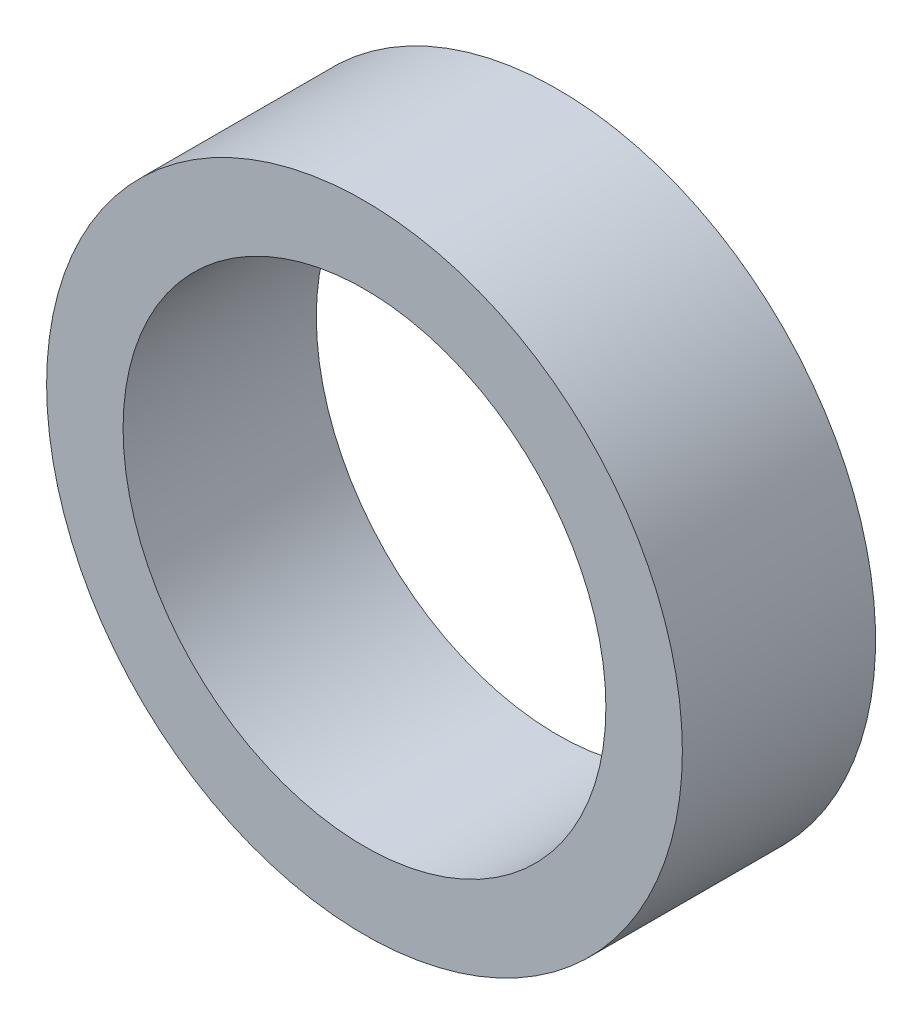
ISO-10303-21;
HEADER;
FILE_DESCRIPTION(('STEP AP214'),'2;1');
FILE_NAME('part.step','',(''),(''),'','','');
FILE_SCHEMA(('AUTOMOTIVE_DESIGN { 1 0 10303 214 1 1 1 1 }'));
ENDSEC;
DATA;
#1=APPLICATION_CONTEXT('core data for automotive mechanical design processes');
#2=APPLICATION_PROTOCOL_DEFINITION('international standard','automotive_design',2000,#1);
#3=PRODUCT_CONTEXT('',#1,'mechanical');
#4=PRODUCT('Part','Part','',(#3));
#5=PRODUCT_RELATED_PRODUCT_CATEGORY('part','',(#4));
#6=PRODUCT_DEFINITION_FORMATION('','',#4);
#7=PRODUCT_DEFINITION_CONTEXT('part definition',#1,'design');
#8=PRODUCT_DEFINITION('design','',#6,#7);
#9=PRODUCT_DEFINITION_SHAPE('','',#8);
#10=(LENGTH_UNIT() NAMED_UNIT(*) SI_UNIT(.MILLI.,.METRE.));
#11=(NAMED_UNIT(*) PLANE_ANGLE_UNIT() SI_UNIT($,.RADIAN.));
#12=(NAMED_UNIT(*) SI_UNIT($,.STERADIAN.) SOLID_ANGLE_UNIT());
#13=UNCERTAINTY_MEASURE_WITH_UNIT(LENGTH_MEASURE(1.E-05),#10,'distance_accuracy_value','');
#14=(GEOMETRIC_REPRESENTATION_CONTEXT(3) GLOBAL_UNCERTAINTY_ASSIGNED_CONTEXT((#13)) GLOBAL_UNIT_ASSIGNED_CONTEXT((#10,
#11,#12)) REPRESENTATION_CONTEXT('',''));
#15=CARTESIAN_POINT('',(0.,0.,0.));
#16=DIRECTION('',(0.,0.,1.));
#17=DIRECTION('',(1.,0.,0.));
#18=AXIS2_PLACEMENT_3D('',#15,#16,#17);
#19=CARTESIAN_POINT('',(0.,0.,6.99));
#20=DIRECTION('',(0.,0.,-1.));
#21=DIRECTION('',(-1.,0.,0.));
#22=AXIS2_PLACEMENT_3D('',#19,#20,#21);
#23=CYLINDRICAL_SURFACE('',#22,8.21);
#24=CARTESIAN_POINT('',(0.,0.,4.99));
#25=DIRECTION('',(0.,0.,1.));
#26=DIRECTION('',(1.,0.,0.));
#27=AXIS2_PLACEMENT_3D('',#24,#25,#26);
#28=CIRCLE('',#27,8.21);
#29=CARTESIAN_POINT('',(8.21,0.,4.99));
#30=VERTEX_POINT('',#29);
#31=EDGE_CURVE('E10',#30,#30,#28,.T.);
#32=ORIENTED_EDGE('',*,*,#31,.F.);
#33=EDGE_LOOP('',(#32));
#34=FACE_BOUND('',#33,.T.);
#35=CARTESIAN_POINT('',(0.,0.,0.));
#36=DIRECTION('',(0.,0.,-1.));
#37=DIRECTION('',(-1.,0.,0.));
#38=AXIS2_PLACEMENT_3D('',#35,#36,#37);
#39=CIRCLE('',#38,8.21);
#40=CARTESIAN_POINT('',(-8.21,0.,0.));
#41=VERTEX_POINT('',#40);
#42=EDGE_CURVE('E42',#41,#41,#39,.T.);
#43=ORIENTED_EDGE('',*,*,#42,.F.);
#44=EDGE_LOOP('',(#43));
#45=FACE_BOUND('',#44,.T.);
#46=ADVANCED_FACE('F32',(#34,#45),#23,.T.);
#47=CARTESIAN_POINT('',(0.,0.,6.99));
#48=DIRECTION('',(0.,0.,-1.));
#49=DIRECTION('',(-1.,0.,0.));
#50=AXIS2_PLACEMENT_3D('',#47,#48,#49);
#51=CYLINDRICAL_SURFACE('',#50,6.235);
#52=CARTESIAN_POINT('',(0.,0.,4.99));
#53=DIRECTION('',(0.,0.,1.));
#54=DIRECTION('',(1.,0.,0.));
#55=AXIS2_PLACEMENT_3D('',#52,#53,#54);
#56=CIRCLE('',#55,6.235);
#57=CARTESIAN_POINT('',(6.235,0.,4.99));
#58=VERTEX_POINT('',#57);
#59=EDGE_CURVE('E38',#58,#58,#56,.T.);
#60=ORIENTED_EDGE('',*,*,#59,.T.);
#61=EDGE_LOOP('',(#60));
#62=FACE_BOUND('',#61,.T.);
#63=CARTESIAN_POINT('',(0.,0.,0.));
#64=DIRECTION('',(0.,0.,-1.));
#65=DIRECTION('',(-1.,0.,0.));
#66=AXIS2_PLACEMENT_3D('',#63,#64,#65);
#67=CIRCLE('',#66,6.235);
#68=CARTESIAN_POINT('',(-6.235,0.,0.));
#69=VERTEX_POINT('',#68);
#70=EDGE_CURVE('E46',#69,#69,#67,.T.);
#71=ORIENTED_EDGE('',*,*,#70,.T.);
#72=EDGE_LOOP('',(#71));
#73=FACE_BOUND('',#72,.T.);
#74=ADVANCED_FACE('F52',(#62,#73),#51,.F.);
#75=CARTESIAN_POINT('',(0.,0.,4.99));
#76=DIRECTION('',(0.,0.,1.));
#77=DIRECTION('',(1.,0.,0.));
#78=AXIS2_PLACEMENT_3D('',#75,#76,#77);
#79=PLANE('',#78);
#80=ORIENTED_EDGE('',*,*,#59,.F.);
#81=EDGE_LOOP('',(#80));
#82=FACE_BOUND('',#81,.T.);
#83=ORIENTED_EDGE('',*,*,#31,.T.);
#84=EDGE_LOOP('',(#83));
#85=FACE_BOUND('',#84,.T.);
#86=ADVANCED_FACE('F57',(#82,#85),#79,.T.);
#87=CARTESIAN_POINT('',(0.,0.,0.));
#88=DIRECTION('',(0.,0.,-1.));
#89=DIRECTION('',(-1.,0.,0.));
#90=AXIS2_PLACEMENT_3D('',#87,#88,#89);
#91=PLANE('',#90);
#92=ORIENTED_EDGE('',*,*,#70,.F.);
#93=EDGE_LOOP('',(#92));
#94=FACE_BOUND('',#93,.T.);
#95=ORIENTED_EDGE('',*,*,#42,.T.);
#96=EDGE_LOOP('',(#95));
#97=FACE_BOUND('',#96,.T.);
#98=ADVANCED_FACE('F54',(#94,#97),#91,.T.);
#99=CLOSED_SHELL('',(#46,#74,#86,#98));
#100=MANIFOLD_SOLID_BREP('B2',#99);
#101=ADVANCED_BREP_SHAPE_REPRESENTATION('',(#18,#100),#14);
#102=SHAPE_DEFINITION_REPRESENTATION(#9,#101);
ENDSEC;
END-ISO-10303-21;
